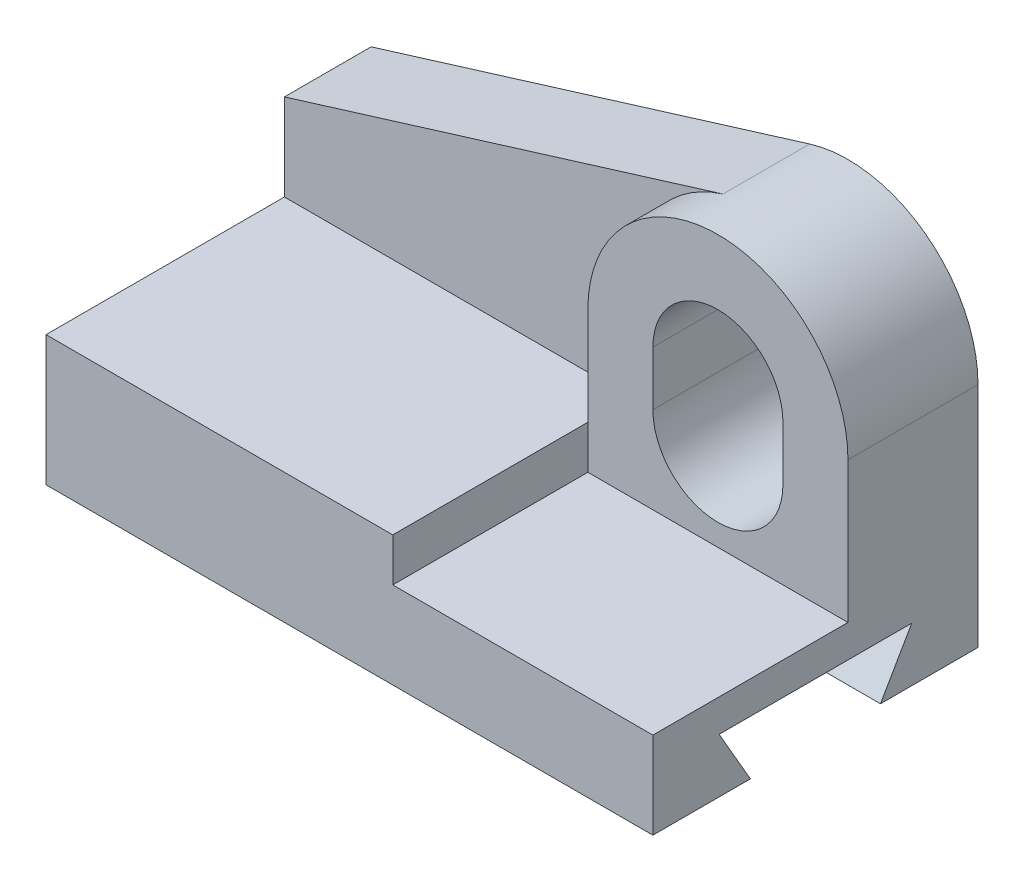
ISO-10303-21;
HEADER;
FILE_DESCRIPTION(('STEP AP214'),'2;1');
FILE_NAME('part.step','',(''),(''),'','','');
FILE_SCHEMA(('AUTOMOTIVE_DESIGN { 1 0 10303 214 1 1 1 1 }'));
ENDSEC;
DATA;
#1=APPLICATION_CONTEXT('core data for automotive mechanical design processes');
#2=APPLICATION_PROTOCOL_DEFINITION('international standard','automotive_design',2000,#1);
#3=PRODUCT_CONTEXT('',#1,'mechanical');
#4=PRODUCT('Part','Part','',(#3));
#5=PRODUCT_RELATED_PRODUCT_CATEGORY('part','',(#4));
#6=PRODUCT_DEFINITION_FORMATION('','',#4);
#7=PRODUCT_DEFINITION_CONTEXT('part definition',#1,'design');
#8=PRODUCT_DEFINITION('design','',#6,#7);
#9=PRODUCT_DEFINITION_SHAPE('','',#8);
#10=(LENGTH_UNIT() NAMED_UNIT(*) SI_UNIT(.MILLI.,.METRE.));
#11=(NAMED_UNIT(*) PLANE_ANGLE_UNIT() SI_UNIT($,.RADIAN.));
#12=(NAMED_UNIT(*) SI_UNIT($,.STERADIAN.) SOLID_ANGLE_UNIT());
#13=UNCERTAINTY_MEASURE_WITH_UNIT(LENGTH_MEASURE(1.E-05),#10,'distance_accuracy_value','');
#14=(GEOMETRIC_REPRESENTATION_CONTEXT(3) GLOBAL_UNCERTAINTY_ASSIGNED_CONTEXT((#13)) GLOBAL_UNIT_ASSIGNED_CONTEXT((#10,
#11,#12)) REPRESENTATION_CONTEXT('',''));
#15=CARTESIAN_POINT('',(0.,0.,0.));
#16=DIRECTION('',(0.,0.,1.));
#17=DIRECTION('',(1.,0.,0.));
#18=AXIS2_PLACEMENT_3D('',#15,#16,#17);
#19=CARTESIAN_POINT('',(28.,8.,-7.));
#20=DIRECTION('',(0.,0.,-1.));
#21=DIRECTION('',(-1.,0.,0.));
#22=AXIS2_PLACEMENT_3D('',#19,#20,#21);
#23=PLANE('',#22);
#24=CARTESIAN_POINT('',(16.,21.,-6.99999999999999));
#25=DIRECTION('',(0.,0.,1.));
#26=DIRECTION('',(1.,0.,0.));
#27=AXIS2_PLACEMENT_3D('',#24,#25,#26);
#28=CIRCLE('',#27,12.);
#29=CARTESIAN_POINT('',(12.466636051299,32.4680137428423,-6.99999999999999));
#30=VERTEX_POINT('',#29);
#31=CARTESIAN_POINT('',(4.,21.,-6.99999999999999));
#32=VERTEX_POINT('',#31);
#33=EDGE_CURVE('E196',#30,#32,#28,.T.);
#34=ORIENTED_EDGE('',*,*,#33,.F.);
#35=DIRECTION('',(0.955667811903527,0.29444699572508,0.));
#36=VECTOR('',#35,1.);
#37=CARTESIAN_POINT('',(-8.05544325468579,26.1450377857018,-6.99999999999999));
#38=LINE('',#37,#36);
#39=CARTESIAN_POINT('',(-28.,20.,-7.));
#40=VERTEX_POINT('',#39);
#41=EDGE_CURVE('E228',#40,#30,#38,.T.);
#42=ORIENTED_EDGE('',*,*,#41,.F.);
#43=DIRECTION('',(0.,-1.,0.));
#44=VECTOR('',#43,1.);
#45=CARTESIAN_POINT('',(-28.,37.,-7.));
#46=LINE('',#45,#44);
#47=CARTESIAN_POINT('',(-28.,12.,-7.));
#48=VERTEX_POINT('',#47);
#49=EDGE_CURVE('E245',#40,#48,#46,.T.);
#50=ORIENTED_EDGE('',*,*,#49,.T.);
#51=DIRECTION('',(1.,0.,0.));
#52=VECTOR('',#51,1.);
#53=CARTESIAN_POINT('',(-28.,12.,-7.));
#54=LINE('',#53,#52);
#55=CARTESIAN_POINT('',(4.,12.,-6.99999999999999));
#56=VERTEX_POINT('',#55);
#57=EDGE_CURVE('E242',#48,#56,#54,.T.);
#58=ORIENTED_EDGE('',*,*,#57,.T.);
#59=DIRECTION('',(0.,1.,0.));
#60=VECTOR('',#59,1.);
#61=CARTESIAN_POINT('',(4.,0.,-6.99999999999999));
#62=LINE('',#61,#60);
#63=EDGE_CURVE('E193',#56,#32,#62,.T.);
#64=ORIENTED_EDGE('',*,*,#63,.T.);
#65=EDGE_LOOP('',(#34,#42,#50,#58,#64));
#66=FACE_BOUND('',#65,.T.);
#67=ADVANCED_FACE('F43',(#66),#23,.F.);
#68=CARTESIAN_POINT('',(0.,12.,0.));
#69=DIRECTION('',(0.,-1.,0.));
#70=DIRECTION('',(0.,0.,-1.));
#71=AXIS2_PLACEMENT_3D('',#68,#69,#70);
#72=PLANE('',#71);
#73=ORIENTED_EDGE('',*,*,#57,.F.);
#74=DIRECTION('',(0.,0.,1.));
#75=VECTOR('',#74,1.);
#76=CARTESIAN_POINT('',(-28.,12.,-15.));
#77=LINE('',#76,#75);
#78=CARTESIAN_POINT('',(-28.,12.,15.));
#79=VERTEX_POINT('',#78);
#80=EDGE_CURVE('E290',#48,#79,#77,.T.);
#81=ORIENTED_EDGE('',*,*,#80,.T.);
#82=DIRECTION('',(1.,0.,0.));
#83=VECTOR('',#82,1.);
#84=CARTESIAN_POINT('',(-28.,12.,15.));
#85=LINE('',#84,#83);
#86=CARTESIAN_POINT('',(4.,12.,15.));
#87=VERTEX_POINT('',#86);
#88=EDGE_CURVE('E287',#79,#87,#85,.T.);
#89=ORIENTED_EDGE('',*,*,#88,.T.);
#90=DIRECTION('',(0.,0.,1.));
#91=VECTOR('',#90,1.);
#92=CARTESIAN_POINT('',(4.,12.,-6.99999999999999));
#93=LINE('',#92,#91);
#94=CARTESIAN_POINT('',(4.,12.,-2.99999999999999));
#95=VERTEX_POINT('',#94);
#96=EDGE_CURVE('E247',#95,#87,#93,.T.);
#97=ORIENTED_EDGE('',*,*,#96,.F.);
#98=EDGE_CURVE('E252',#56,#95,#93,.T.);
#99=ORIENTED_EDGE('',*,*,#98,.F.);
#100=EDGE_LOOP('',(#73,#81,#89,#97,#99));
#101=FACE_BOUND('',#100,.T.);
#102=ADVANCED_FACE('F376',(#101),#72,.F.);
#103=CARTESIAN_POINT('',(0.,0.,0.));
#104=DIRECTION('',(0.,-1.,0.));
#105=DIRECTION('',(0.,0.,-1.));
#106=AXIS2_PLACEMENT_3D('',#103,#104,#105);
#107=PLANE('',#106);
#108=DIRECTION('',(-1.,0.,0.));
#109=VECTOR('',#108,1.);
#110=CARTESIAN_POINT('',(28.,0.,5.99999999999999));
#111=LINE('',#110,#109);
#112=CARTESIAN_POINT('',(28.,0.,5.99999999999999));
#113=VERTEX_POINT('',#112);
#114=CARTESIAN_POINT('',(-28.,0.,6.00000000000001));
#115=VERTEX_POINT('',#114);
#116=EDGE_CURVE('E278',#113,#115,#111,.T.);
#117=ORIENTED_EDGE('',*,*,#116,.F.);
#118=DIRECTION('',(0.,0.,1.));
#119=VECTOR('',#118,1.);
#120=CARTESIAN_POINT('',(28.,0.,-15.));
#121=LINE('',#120,#119);
#122=CARTESIAN_POINT('',(28.,0.,15.));
#123=VERTEX_POINT('',#122);
#124=EDGE_CURVE('E296',#113,#123,#121,.T.);
#125=ORIENTED_EDGE('',*,*,#124,.T.);
#126=DIRECTION('',(1.,0.,0.));
#127=VECTOR('',#126,1.);
#128=CARTESIAN_POINT('',(-28.,0.,15.));
#129=LINE('',#128,#127);
#130=CARTESIAN_POINT('',(-28.,0.,15.));
#131=VERTEX_POINT('',#130);
#132=EDGE_CURVE('E280',#131,#123,#129,.T.);
#133=ORIENTED_EDGE('',*,*,#132,.F.);
#134=DIRECTION('',(0.,0.,1.));
#135=VECTOR('',#134,1.);
#136=CARTESIAN_POINT('',(-28.,0.,-15.));
#137=LINE('',#136,#135);
#138=EDGE_CURVE('E303',#115,#131,#137,.T.);
#139=ORIENTED_EDGE('',*,*,#138,.F.);
#140=EDGE_LOOP('',(#117,#125,#133,#139));
#141=FACE_BOUND('',#140,.T.);
#142=ADVANCED_FACE('F354',(#141),#107,.T.);
#143=CARTESIAN_POINT('',(-28.,12.,15.));
#144=DIRECTION('',(0.,0.,-1.));
#145=DIRECTION('',(-1.,0.,0.));
#146=AXIS2_PLACEMENT_3D('',#143,#144,#145);
#147=PLANE('',#146);
#148=DIRECTION('',(1.,0.,0.));
#149=VECTOR('',#148,1.);
#150=CARTESIAN_POINT('',(28.,8.,15.));
#151=LINE('',#150,#149);
#152=CARTESIAN_POINT('',(4.,8.,15.));
#153=VERTEX_POINT('',#152);
#154=CARTESIAN_POINT('',(28.,8.,15.));
#155=VERTEX_POINT('',#154);
#156=EDGE_CURVE('E254',#153,#155,#151,.T.);
#157=ORIENTED_EDGE('',*,*,#156,.F.);
#158=DIRECTION('',(0.,1.,0.));
#159=VECTOR('',#158,1.);
#160=CARTESIAN_POINT('',(4.,8.,15.));
#161=LINE('',#160,#159);
#162=EDGE_CURVE('E256',#153,#87,#161,.T.);
#163=ORIENTED_EDGE('',*,*,#162,.T.);
#164=ORIENTED_EDGE('',*,*,#88,.F.);
#165=DIRECTION('',(0.,-1.,0.));
#166=VECTOR('',#165,1.);
#167=CARTESIAN_POINT('',(-28.,12.,15.));
#168=LINE('',#167,#166);
#169=EDGE_CURVE('E293',#79,#131,#168,.T.);
#170=ORIENTED_EDGE('',*,*,#169,.T.);
#171=ORIENTED_EDGE('',*,*,#132,.T.);
#172=DIRECTION('',(0.,-1.,0.));
#173=VECTOR('',#172,1.);
#174=CARTESIAN_POINT('',(28.,12.,15.));
#175=LINE('',#174,#173);
#176=EDGE_CURVE('E11',#155,#123,#175,.T.);
#177=ORIENTED_EDGE('',*,*,#176,.F.);
#178=EDGE_LOOP('',(#157,#163,#164,#170,#171,#177));
#179=FACE_BOUND('',#178,.T.);
#180=ADVANCED_FACE('F45',(#179),#147,.F.);
#181=CARTESIAN_POINT('',(28.,12.,-15.));
#182=DIRECTION('',(1.,0.,0.));
#183=DIRECTION('',(0.,0.,-1.));
#184=AXIS2_PLACEMENT_3D('',#181,#182,#183);
#185=PLANE('',#184);
#186=DIRECTION('',(0.,0.,1.));
#187=VECTOR('',#186,1.);
#188=CARTESIAN_POINT('',(28.,21.,-32.));
#189=LINE('',#188,#187);
#190=CARTESIAN_POINT('',(28.,21.,-15.));
#191=VERTEX_POINT('',#190);
#192=CARTESIAN_POINT('',(28.,21.,-2.99999999999999));
#193=VERTEX_POINT('',#192);
#194=EDGE_CURVE('E232',#191,#193,#189,.T.);
#195=ORIENTED_EDGE('',*,*,#194,.T.);
#196=DIRECTION('',(0.,1.,0.));
#197=VECTOR('',#196,1.);
#198=CARTESIAN_POINT('',(28.,0.,-2.99999999999999));
#199=LINE('',#198,#197);
#200=CARTESIAN_POINT('',(28.,8.,-2.99999999999999));
#201=VERTEX_POINT('',#200);
#202=EDGE_CURVE('E210',#201,#193,#199,.T.);
#203=ORIENTED_EDGE('',*,*,#202,.F.);
#204=DIRECTION('',(0.,0.,-1.));
#205=VECTOR('',#204,1.);
#206=CARTESIAN_POINT('',(28.,8.,-7.));
#207=LINE('',#206,#205);
#208=EDGE_CURVE('E248',#155,#201,#207,.T.);
#209=ORIENTED_EDGE('',*,*,#208,.F.);
#210=ORIENTED_EDGE('',*,*,#176,.T.);
#211=ORIENTED_EDGE('',*,*,#124,.F.);
#212=DIRECTION('',(0.,0.866025403784436,0.500000000000004));
#213=VECTOR('',#212,1.);
#214=CARTESIAN_POINT('',(28.,0.,5.99999999999999));
#215=LINE('',#214,#213);
#216=CARTESIAN_POINT('',(28.,5.,8.88675134594815));
#217=VERTEX_POINT('',#216);
#218=EDGE_CURVE('E261',#113,#217,#215,.T.);
#219=ORIENTED_EDGE('',*,*,#218,.T.);
#220=DIRECTION('',(0.,0.,-1.));
#221=VECTOR('',#220,1.);
#222=CARTESIAN_POINT('',(28.,5.,8.88675134594815));
#223=LINE('',#222,#221);
#224=CARTESIAN_POINT('',(28.,5.,-8.88675134594817));
#225=VERTEX_POINT('',#224);
#226=EDGE_CURVE('E264',#217,#225,#223,.T.);
#227=ORIENTED_EDGE('',*,*,#226,.T.);
#228=DIRECTION('',(0.,-0.866025403784436,0.500000000000004));
#229=VECTOR('',#228,1.);
#230=CARTESIAN_POINT('',(28.,5.,-8.88675134594817));
#231=LINE('',#230,#229);
#232=CARTESIAN_POINT('',(28.,0.,-6.00000000000001));
#233=VERTEX_POINT('',#232);
#234=EDGE_CURVE('E268',#225,#233,#231,.T.);
#235=ORIENTED_EDGE('',*,*,#234,.T.);
#236=CARTESIAN_POINT('',(28.,0.,-15.));
#237=VERTEX_POINT('',#236);
#238=EDGE_CURVE('E297',#237,#233,#121,.T.);
#239=ORIENTED_EDGE('',*,*,#238,.F.);
#240=DIRECTION('',(0.,-1.,0.));
#241=VECTOR('',#240,1.);
#242=CARTESIAN_POINT('',(28.,12.,-15.));
#243=LINE('',#242,#241);
#244=EDGE_CURVE('E51',#191,#237,#243,.T.);
#245=ORIENTED_EDGE('',*,*,#244,.F.);
#246=EDGE_LOOP('',(#195,#203,#209,#210,#211,#219,#227,#235,#239,#245));
#247=FACE_BOUND('',#246,.T.);
#248=ADVANCED_FACE('F318',(#247),#185,.T.);
#249=CARTESIAN_POINT('',(-28.,12.,-15.));
#250=DIRECTION('',(0.,0.,-1.));
#251=DIRECTION('',(-1.,0.,0.));
#252=AXIS2_PLACEMENT_3D('',#249,#250,#251);
#253=PLANE('',#252);
#254=DIRECTION('',(0.,-1.,0.));
#255=VECTOR('',#254,1.);
#256=CARTESIAN_POINT('',(10.,0.,-15.));
#257=LINE('',#256,#255);
#258=CARTESIAN_POINT('',(10.,21.,-15.));
#259=VERTEX_POINT('',#258);
#260=CARTESIAN_POINT('',(10.,16.,-15.));
#261=VERTEX_POINT('',#260);
#262=EDGE_CURVE('E217',#259,#261,#257,.T.);
#263=ORIENTED_EDGE('',*,*,#262,.T.);
#264=CARTESIAN_POINT('',(16.,16.,-15.));
#265=DIRECTION('',(0.,0.,1.));
#266=DIRECTION('',(1.,0.,0.));
#267=AXIS2_PLACEMENT_3D('',#264,#265,#266);
#268=CIRCLE('',#267,6.);
#269=CARTESIAN_POINT('',(22.,16.,-15.));
#270=VERTEX_POINT('',#269);
#271=EDGE_CURVE('E220',#261,#270,#268,.T.);
#272=ORIENTED_EDGE('',*,*,#271,.T.);
#273=DIRECTION('',(0.,-1.,0.));
#274=VECTOR('',#273,1.);
#275=CARTESIAN_POINT('',(22.,0.,-15.));
#276=LINE('',#275,#274);
#277=CARTESIAN_POINT('',(22.,21.,-15.));
#278=VERTEX_POINT('',#277);
#279=EDGE_CURVE('E175',#278,#270,#276,.T.);
#280=ORIENTED_EDGE('',*,*,#279,.F.);
#281=CARTESIAN_POINT('',(16.,21.,-15.));
#282=DIRECTION('',(0.,0.,1.));
#283=DIRECTION('',(1.,0.,0.));
#284=AXIS2_PLACEMENT_3D('',#281,#282,#283);
#285=CIRCLE('',#284,6.);
#286=EDGE_CURVE('E223',#278,#259,#285,.T.);
#287=ORIENTED_EDGE('',*,*,#286,.T.);
#288=EDGE_LOOP('',(#263,#272,#280,#287));
#289=FACE_BOUND('',#288,.T.);
#290=CARTESIAN_POINT('',(16.,21.,-15.));
#291=DIRECTION('',(0.,0.,-1.));
#292=DIRECTION('',(-1.,0.,0.));
#293=AXIS2_PLACEMENT_3D('',#290,#291,#292);
#294=CIRCLE('',#293,12.);
#295=CARTESIAN_POINT('',(12.466636051299,32.4680137428423,-15.));
#296=VERTEX_POINT('',#295);
#297=EDGE_CURVE('E240',#191,#296,#294,.F.);
#298=ORIENTED_EDGE('',*,*,#297,.F.);
#299=ORIENTED_EDGE('',*,*,#244,.T.);
#300=DIRECTION('',(1.,0.,0.));
#301=VECTOR('',#300,1.);
#302=CARTESIAN_POINT('',(-28.,0.,-15.));
#303=LINE('',#302,#301);
#304=CARTESIAN_POINT('',(-28.,0.,-15.));
#305=VERTEX_POINT('',#304);
#306=EDGE_CURVE('E300',#305,#237,#303,.T.);
#307=ORIENTED_EDGE('',*,*,#306,.F.);
#308=DIRECTION('',(0.,-1.,0.));
#309=VECTOR('',#308,1.);
#310=CARTESIAN_POINT('',(-28.,12.,-15.));
#311=LINE('',#310,#309);
#312=CARTESIAN_POINT('',(-28.,20.,-15.));
#313=VERTEX_POINT('',#312);
#314=EDGE_CURVE('E308',#313,#305,#311,.T.);
#315=ORIENTED_EDGE('',*,*,#314,.F.);
#316=DIRECTION('',(-0.955667811903527,-0.29444699572508,0.));
#317=VECTOR('',#316,1.);
#318=CARTESIAN_POINT('',(-30.2511481290092,19.3064077336678,-15.));
#319=LINE('',#318,#317);
#320=EDGE_CURVE('E234',#296,#313,#319,.T.);
#321=ORIENTED_EDGE('',*,*,#320,.F.);
#322=EDGE_LOOP('',(#298,#299,#307,#315,#321));
#323=FACE_BOUND('',#322,.T.);
#324=ADVANCED_FACE('F314',(#289,#323),#253,.T.);
#325=CARTESIAN_POINT('',(-28.,12.,-15.));
#326=DIRECTION('',(1.,0.,0.));
#327=DIRECTION('',(0.,0.,-1.));
#328=AXIS2_PLACEMENT_3D('',#325,#326,#327);
#329=PLANE('',#328);
#330=ORIENTED_EDGE('',*,*,#49,.F.);
#331=DIRECTION('',(0.,0.,1.));
#332=VECTOR('',#331,1.);
#333=CARTESIAN_POINT('',(-28.,20.,-32.));
#334=LINE('',#333,#332);
#335=EDGE_CURVE('E66',#313,#40,#334,.T.);
#336=ORIENTED_EDGE('',*,*,#335,.F.);
#337=ORIENTED_EDGE('',*,*,#314,.T.);
#338=CARTESIAN_POINT('',(-28.,0.,-5.99999999999999));
#339=VERTEX_POINT('',#338);
#340=EDGE_CURVE('E291',#305,#339,#137,.T.);
#341=ORIENTED_EDGE('',*,*,#340,.T.);
#342=DIRECTION('',(0.,-0.866025403784436,0.500000000000004));
#343=VECTOR('',#342,1.);
#344=CARTESIAN_POINT('',(-28.,5.,-8.88675134594816));
#345=LINE('',#344,#343);
#346=CARTESIAN_POINT('',(-28.,5.,-8.88675134594816));
#347=VERTEX_POINT('',#346);
#348=EDGE_CURVE('E265',#347,#339,#345,.T.);
#349=ORIENTED_EDGE('',*,*,#348,.F.);
#350=DIRECTION('',(0.,0.,-1.));
#351=VECTOR('',#350,1.);
#352=CARTESIAN_POINT('',(-28.,5.,8.88675134594817));
#353=LINE('',#352,#351);
#354=CARTESIAN_POINT('',(-28.,5.,8.88675134594817));
#355=VERTEX_POINT('',#354);
#356=EDGE_CURVE('E274',#355,#347,#353,.T.);
#357=ORIENTED_EDGE('',*,*,#356,.F.);
#358=DIRECTION('',(0.,0.866025403784436,0.500000000000004));
#359=VECTOR('',#358,1.);
#360=CARTESIAN_POINT('',(-28.,0.,6.00000000000001));
#361=LINE('',#360,#359);
#362=EDGE_CURVE('E260',#115,#355,#361,.T.);
#363=ORIENTED_EDGE('',*,*,#362,.F.);
#364=ORIENTED_EDGE('',*,*,#138,.T.);
#365=ORIENTED_EDGE('',*,*,#169,.F.);
#366=ORIENTED_EDGE('',*,*,#80,.F.);
#367=EDGE_LOOP('',(#330,#336,#337,#341,#349,#357,#363,#364,#365,#366));
#368=FACE_BOUND('',#367,.T.);
#369=ADVANCED_FACE('F326',(#368),#329,.F.);
#370=DIRECTION('',(-1.,0.,0.));
#371=VECTOR('',#370,1.);
#372=CARTESIAN_POINT('',(28.,0.,-6.00000000000001));
#373=LINE('',#372,#371);
#374=EDGE_CURVE('E281',#233,#339,#373,.T.);
#375=ORIENTED_EDGE('',*,*,#374,.T.);
#376=ORIENTED_EDGE('',*,*,#340,.F.);
#377=ORIENTED_EDGE('',*,*,#306,.T.);
#378=ORIENTED_EDGE('',*,*,#238,.T.);
#379=EDGE_LOOP('',(#375,#376,#377,#378));
#380=FACE_BOUND('',#379,.T.);
#381=ADVANCED_FACE('F322',(#380),#107,.T.);
#382=CARTESIAN_POINT('',(28.,0.,5.99999999999999));
#383=DIRECTION('',(0.,-0.500000000000004,0.866025403784436));
#384=DIRECTION('',(0.,-0.866025403784436,-0.500000000000004));
#385=AXIS2_PLACEMENT_3D('',#382,#383,#384);
#386=PLANE('',#385);
#387=ORIENTED_EDGE('',*,*,#362,.T.);
#388=DIRECTION('',(-1.,0.,0.));
#389=VECTOR('',#388,1.);
#390=CARTESIAN_POINT('',(28.,5.,8.88675134594815));
#391=LINE('',#390,#389);
#392=EDGE_CURVE('E271',#217,#355,#391,.T.);
#393=ORIENTED_EDGE('',*,*,#392,.F.);
#394=ORIENTED_EDGE('',*,*,#218,.F.);
#395=ORIENTED_EDGE('',*,*,#116,.T.);
#396=EDGE_LOOP('',(#387,#393,#394,#395));
#397=FACE_BOUND('',#396,.T.);
#398=ADVANCED_FACE('F360',(#397),#386,.F.);
#399=CARTESIAN_POINT('',(28.,5.,-8.88675134594817));
#400=DIRECTION('',(0.,-0.500000000000004,-0.866025403784436));
#401=DIRECTION('',(0.,0.866025403784436,-0.500000000000005));
#402=AXIS2_PLACEMENT_3D('',#399,#400,#401);
#403=PLANE('',#402);
#404=ORIENTED_EDGE('',*,*,#348,.T.);
#405=ORIENTED_EDGE('',*,*,#374,.F.);
#406=ORIENTED_EDGE('',*,*,#234,.F.);
#407=DIRECTION('',(-1.,0.,0.));
#408=VECTOR('',#407,1.);
#409=CARTESIAN_POINT('',(28.,5.,-8.88675134594817));
#410=LINE('',#409,#408);
#411=EDGE_CURVE('E284',#225,#347,#410,.T.);
#412=ORIENTED_EDGE('',*,*,#411,.T.);
#413=EDGE_LOOP('',(#404,#405,#406,#412));
#414=FACE_BOUND('',#413,.T.);
#415=ADVANCED_FACE('F365',(#414),#403,.F.);
#416=CARTESIAN_POINT('',(28.,5.,8.88675134594815));
#417=DIRECTION('',(0.,1.,0.));
#418=DIRECTION('',(0.,0.,1.));
#419=AXIS2_PLACEMENT_3D('',#416,#417,#418);
#420=PLANE('',#419);
#421=ORIENTED_EDGE('',*,*,#356,.T.);
#422=ORIENTED_EDGE('',*,*,#411,.F.);
#423=ORIENTED_EDGE('',*,*,#226,.F.);
#424=ORIENTED_EDGE('',*,*,#392,.T.);
#425=EDGE_LOOP('',(#421,#422,#423,#424));
#426=FACE_BOUND('',#425,.T.);
#427=ADVANCED_FACE('F363',(#426),#420,.F.);
#428=CARTESIAN_POINT('',(4.,8.,-6.99999999999999));
#429=DIRECTION('',(-1.,0.,0.));
#430=DIRECTION('',(0.,0.,1.));
#431=AXIS2_PLACEMENT_3D('',#428,#429,#430);
#432=PLANE('',#431);
#433=DIRECTION('',(0.,0.,1.));
#434=VECTOR('',#433,1.);
#435=CARTESIAN_POINT('',(4.,8.,-6.99999999999999));
#436=LINE('',#435,#434);
#437=CARTESIAN_POINT('',(4.,8.,-2.99999999999999));
#438=VERTEX_POINT('',#437);
#439=EDGE_CURVE('E251',#438,#153,#436,.T.);
#440=ORIENTED_EDGE('',*,*,#439,.F.);
#441=DIRECTION('',(0.,1.,0.));
#442=VECTOR('',#441,1.);
#443=CARTESIAN_POINT('',(4.,0.,-2.99999999999999));
#444=LINE('',#443,#442);
#445=EDGE_CURVE('E205',#438,#95,#444,.T.);
#446=ORIENTED_EDGE('',*,*,#445,.T.);
#447=ORIENTED_EDGE('',*,*,#96,.T.);
#448=ORIENTED_EDGE('',*,*,#162,.F.);
#449=EDGE_LOOP('',(#440,#446,#447,#448));
#450=FACE_BOUND('',#449,.T.);
#451=ADVANCED_FACE('F343',(#450),#432,.F.);
#452=CARTESIAN_POINT('',(0.,8.,0.));
#453=DIRECTION('',(0.,-1.,0.));
#454=DIRECTION('',(0.,0.,-1.));
#455=AXIS2_PLACEMENT_3D('',#452,#453,#454);
#456=PLANE('',#455);
#457=ORIENTED_EDGE('',*,*,#208,.T.);
#458=DIRECTION('',(1.,0.,0.));
#459=VECTOR('',#458,1.);
#460=CARTESIAN_POINT('',(0.,8.,-2.99999999999999));
#461=LINE('',#460,#459);
#462=EDGE_CURVE('E208',#438,#201,#461,.T.);
#463=ORIENTED_EDGE('',*,*,#462,.F.);
#464=ORIENTED_EDGE('',*,*,#439,.T.);
#465=ORIENTED_EDGE('',*,*,#156,.T.);
#466=EDGE_LOOP('',(#457,#463,#464,#465));
#467=FACE_BOUND('',#466,.T.);
#468=ADVANCED_FACE('F340',(#467),#456,.F.);
#469=CARTESIAN_POINT('',(16.,21.,-32.));
#470=DIRECTION('',(0.,0.,1.));
#471=DIRECTION('',(1.,0.,0.));
#472=AXIS2_PLACEMENT_3D('',#469,#470,#471);
#473=CYLINDRICAL_SURFACE('',#472,12.);
#474=ORIENTED_EDGE('',*,*,#297,.T.);
#475=DIRECTION('',(0.,0.,1.));
#476=VECTOR('',#475,1.);
#477=CARTESIAN_POINT('',(12.466636051299,32.4680137428423,-32.));
#478=LINE('',#477,#476);
#479=EDGE_CURVE('E235',#296,#30,#478,.T.);
#480=ORIENTED_EDGE('',*,*,#479,.T.);
#481=ORIENTED_EDGE('',*,*,#33,.T.);
#482=DIRECTION('',(0.,0.,-1.));
#483=VECTOR('',#482,1.);
#484=CARTESIAN_POINT('',(4.,21.,-2.99999999999999));
#485=LINE('',#484,#483);
#486=CARTESIAN_POINT('',(4.,21.,-2.99999999999999));
#487=VERTEX_POINT('',#486);
#488=EDGE_CURVE('E213',#487,#32,#485,.T.);
#489=ORIENTED_EDGE('',*,*,#488,.F.);
#490=CARTESIAN_POINT('',(16.,21.,-2.99999999999999));
#491=DIRECTION('',(0.,0.,1.));
#492=DIRECTION('',(1.,0.,0.));
#493=AXIS2_PLACEMENT_3D('',#490,#491,#492);
#494=CIRCLE('',#493,12.);
#495=EDGE_CURVE('E201',#193,#487,#494,.T.);
#496=ORIENTED_EDGE('',*,*,#495,.F.);
#497=ORIENTED_EDGE('',*,*,#194,.F.);
#498=EDGE_LOOP('',(#474,#480,#481,#489,#496,#497));
#499=FACE_BOUND('',#498,.T.);
#500=ADVANCED_FACE('F331',(#499),#473,.T.);
#501=CARTESIAN_POINT('',(-8.05544325468579,26.1450377857018,-32.));
#502=DIRECTION('',(0.29444699572508,-0.955667811903527,0.));
#503=DIRECTION('',(0.955667811903527,0.29444699572508,0.));
#504=AXIS2_PLACEMENT_3D('',#501,#502,#503);
#505=PLANE('',#504);
#506=ORIENTED_EDGE('',*,*,#320,.T.);
#507=ORIENTED_EDGE('',*,*,#335,.T.);
#508=ORIENTED_EDGE('',*,*,#41,.T.);
#509=ORIENTED_EDGE('',*,*,#479,.F.);
#510=EDGE_LOOP('',(#506,#507,#508,#509));
#511=FACE_BOUND('',#510,.T.);
#512=ADVANCED_FACE('F329',(#511),#505,.F.);
#513=CARTESIAN_POINT('',(10.,0.,-15.));
#514=DIRECTION('',(-1.,0.,0.));
#515=DIRECTION('',(0.,-1.,0.));
#516=AXIS2_PLACEMENT_3D('',#513,#514,#515);
#517=PLANE('',#516);
#518=DIRECTION('',(0.,0.,1.));
#519=VECTOR('',#518,1.);
#520=CARTESIAN_POINT('',(10.,21.,-15.));
#521=LINE('',#520,#519);
#522=CARTESIAN_POINT('',(10.,21.,-2.99999999999999));
#523=VERTEX_POINT('',#522);
#524=EDGE_CURVE('E226',#259,#523,#521,.T.);
#525=ORIENTED_EDGE('',*,*,#524,.T.);
#526=DIRECTION('',(0.,1.,0.));
#527=VECTOR('',#526,1.);
#528=CARTESIAN_POINT('',(10.,0.,-2.99999999999999));
#529=LINE('',#528,#527);
#530=CARTESIAN_POINT('',(10.,16.,-2.99999999999999));
#531=VERTEX_POINT('',#530);
#532=EDGE_CURVE('E186',#531,#523,#529,.T.);
#533=ORIENTED_EDGE('',*,*,#532,.F.);
#534=DIRECTION('',(0.,0.,1.));
#535=VECTOR('',#534,1.);
#536=CARTESIAN_POINT('',(10.,16.,-15.));
#537=LINE('',#536,#535);
#538=EDGE_CURVE('E178',#261,#531,#537,.T.);
#539=ORIENTED_EDGE('',*,*,#538,.F.);
#540=ORIENTED_EDGE('',*,*,#262,.F.);
#541=EDGE_LOOP('',(#525,#533,#539,#540));
#542=FACE_BOUND('',#541,.T.);
#543=ADVANCED_FACE('F391',(#542),#517,.F.);
#544=CARTESIAN_POINT('',(16.,21.,-15.));
#545=DIRECTION('',(0.,0.,1.));
#546=DIRECTION('',(1.,0.,0.));
#547=AXIS2_PLACEMENT_3D('',#544,#545,#546);
#548=CYLINDRICAL_SURFACE('',#547,6.);
#549=DIRECTION('',(0.,0.,1.));
#550=VECTOR('',#549,1.);
#551=CARTESIAN_POINT('',(22.,21.,-15.));
#552=LINE('',#551,#550);
#553=CARTESIAN_POINT('',(22.,21.,-2.99999999999999));
#554=VERTEX_POINT('',#553);
#555=EDGE_CURVE('E177',#278,#554,#552,.T.);
#556=ORIENTED_EDGE('',*,*,#555,.T.);
#557=CARTESIAN_POINT('',(16.,21.,-2.99999999999999));
#558=DIRECTION('',(0.,0.,1.));
#559=DIRECTION('',(1.,0.,0.));
#560=AXIS2_PLACEMENT_3D('',#557,#558,#559);
#561=CIRCLE('',#560,6.);
#562=EDGE_CURVE('E192',#523,#554,#561,.F.);
#563=ORIENTED_EDGE('',*,*,#562,.F.);
#564=ORIENTED_EDGE('',*,*,#524,.F.);
#565=ORIENTED_EDGE('',*,*,#286,.F.);
#566=EDGE_LOOP('',(#556,#563,#564,#565));
#567=FACE_BOUND('',#566,.T.);
#568=ADVANCED_FACE('F396',(#567),#548,.F.);
#569=CARTESIAN_POINT('',(22.,0.,-15.));
#570=DIRECTION('',(-1.,0.,0.));
#571=DIRECTION('',(0.,0.,1.));
#572=AXIS2_PLACEMENT_3D('',#569,#570,#571);
#573=PLANE('',#572);
#574=DIRECTION('',(0.,0.,1.));
#575=VECTOR('',#574,1.);
#576=CARTESIAN_POINT('',(22.,16.,-15.));
#577=LINE('',#576,#575);
#578=CARTESIAN_POINT('',(22.,16.,-2.99999999999999));
#579=VERTEX_POINT('',#578);
#580=EDGE_CURVE('E58',#270,#579,#577,.T.);
#581=ORIENTED_EDGE('',*,*,#580,.T.);
#582=DIRECTION('',(0.,-1.,0.));
#583=VECTOR('',#582,1.);
#584=CARTESIAN_POINT('',(22.,0.,-2.99999999999999));
#585=LINE('',#584,#583);
#586=EDGE_CURVE('E173',#554,#579,#585,.T.);
#587=ORIENTED_EDGE('',*,*,#586,.F.);
#588=ORIENTED_EDGE('',*,*,#555,.F.);
#589=ORIENTED_EDGE('',*,*,#279,.T.);
#590=EDGE_LOOP('',(#581,#587,#588,#589));
#591=FACE_BOUND('',#590,.T.);
#592=ADVANCED_FACE('F171',(#591),#573,.T.);
#593=CARTESIAN_POINT('',(16.,16.,-15.));
#594=DIRECTION('',(0.,0.,1.));
#595=DIRECTION('',(1.,0.,0.));
#596=AXIS2_PLACEMENT_3D('',#593,#594,#595);
#597=CYLINDRICAL_SURFACE('',#596,6.);
#598=ORIENTED_EDGE('',*,*,#538,.T.);
#599=CARTESIAN_POINT('',(16.,16.,-2.99999999999999));
#600=DIRECTION('',(0.,0.,1.));
#601=DIRECTION('',(1.,0.,0.));
#602=AXIS2_PLACEMENT_3D('',#599,#600,#601);
#603=CIRCLE('',#602,6.);
#604=EDGE_CURVE('E181',#579,#531,#603,.F.);
#605=ORIENTED_EDGE('',*,*,#604,.F.);
#606=ORIENTED_EDGE('',*,*,#580,.F.);
#607=ORIENTED_EDGE('',*,*,#271,.F.);
#608=EDGE_LOOP('',(#598,#605,#606,#607));
#609=FACE_BOUND('',#608,.T.);
#610=ADVANCED_FACE('F182',(#609),#597,.F.);
#611=CARTESIAN_POINT('',(4.,0.,-2.99999999999999));
#612=DIRECTION('',(-1.,0.,0.));
#613=DIRECTION('',(0.,-1.,0.));
#614=AXIS2_PLACEMENT_3D('',#611,#612,#613);
#615=PLANE('',#614);
#616=ORIENTED_EDGE('',*,*,#98,.T.);
#617=EDGE_CURVE('E204',#95,#487,#444,.T.);
#618=ORIENTED_EDGE('',*,*,#617,.T.);
#619=ORIENTED_EDGE('',*,*,#488,.T.);
#620=ORIENTED_EDGE('',*,*,#63,.F.);
#621=EDGE_LOOP('',(#616,#618,#619,#620));
#622=FACE_BOUND('',#621,.T.);
#623=ADVANCED_FACE('F400',(#622),#615,.T.);
#624=CARTESIAN_POINT('',(0.,0.,-2.99999999999999));
#625=DIRECTION('',(0.,0.,1.));
#626=DIRECTION('',(1.,0.,0.));
#627=AXIS2_PLACEMENT_3D('',#624,#625,#626);
#628=PLANE('',#627);
#629=ORIENTED_EDGE('',*,*,#586,.T.);
#630=ORIENTED_EDGE('',*,*,#604,.T.);
#631=ORIENTED_EDGE('',*,*,#532,.T.);
#632=ORIENTED_EDGE('',*,*,#562,.T.);
#633=EDGE_LOOP('',(#629,#630,#631,#632));
#634=FACE_BOUND('',#633,.T.);
#635=ORIENTED_EDGE('',*,*,#495,.T.);
#636=ORIENTED_EDGE('',*,*,#617,.F.);
#637=ORIENTED_EDGE('',*,*,#445,.F.);
#638=ORIENTED_EDGE('',*,*,#462,.T.);
#639=ORIENTED_EDGE('',*,*,#202,.T.);
#640=EDGE_LOOP('',(#635,#636,#637,#638,#639));
#641=FACE_BOUND('',#640,.T.);
#642=ADVANCED_FACE('F189',(#634,#641),#628,.T.);
#643=CLOSED_SHELL('',(#67,#102,#142,#180,#248,#324,#369,#381,#398,#415,#427,#451,#468,#500,#512,
#543,#568,#592,#610,#623,#642));
#644=MANIFOLD_SOLID_BREP('B2',#643);
#645=ADVANCED_BREP_SHAPE_REPRESENTATION('',(#18,#644),#14);
#646=SHAPE_DEFINITION_REPRESENTATION(#9,#645);
ENDSEC;
END-ISO-10303-21;
